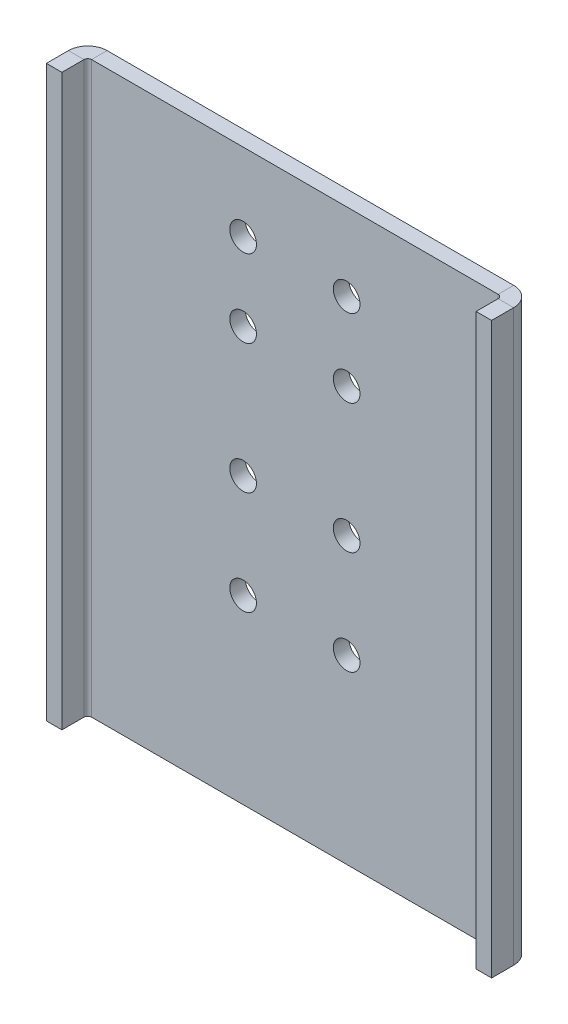
ISO-10303-21;
HEADER;
FILE_DESCRIPTION(('STEP AP214'),'2;1');
FILE_NAME('part.step','',(''),(''),'','','');
FILE_SCHEMA(('AUTOMOTIVE_DESIGN { 1 0 10303 214 1 1 1 1 }'));
ENDSEC;
DATA;
#1=APPLICATION_CONTEXT('core data for automotive mechanical design processes');
#2=APPLICATION_PROTOCOL_DEFINITION('international standard','automotive_design',2000,#1);
#3=PRODUCT_CONTEXT('',#1,'mechanical');
#4=PRODUCT('Part','Part','',(#3));
#5=PRODUCT_RELATED_PRODUCT_CATEGORY('part','',(#4));
#6=PRODUCT_DEFINITION_FORMATION('','',#4);
#7=PRODUCT_DEFINITION_CONTEXT('part definition',#1,'design');
#8=PRODUCT_DEFINITION('design','',#6,#7);
#9=PRODUCT_DEFINITION_SHAPE('','',#8);
#10=(LENGTH_UNIT() NAMED_UNIT(*) SI_UNIT(.MILLI.,.METRE.));
#11=(NAMED_UNIT(*) PLANE_ANGLE_UNIT() SI_UNIT($,.RADIAN.));
#12=(NAMED_UNIT(*) SI_UNIT($,.STERADIAN.) SOLID_ANGLE_UNIT());
#13=UNCERTAINTY_MEASURE_WITH_UNIT(LENGTH_MEASURE(1.E-05),#10,'distance_accuracy_value','');
#14=(GEOMETRIC_REPRESENTATION_CONTEXT(3) GLOBAL_UNCERTAINTY_ASSIGNED_CONTEXT((#13)) GLOBAL_UNIT_ASSIGNED_CONTEXT((#10,
#11,#12)) REPRESENTATION_CONTEXT('',''));
#15=CARTESIAN_POINT('',(0.,0.,0.));
#16=DIRECTION('',(0.,0.,1.));
#17=DIRECTION('',(1.,0.,0.));
#18=AXIS2_PLACEMENT_3D('',#15,#16,#17);
#19=CARTESIAN_POINT('',(0.,0.,-3.));
#20=DIRECTION('',(0.,0.,1.));
#21=DIRECTION('',(1.,0.,0.));
#22=AXIS2_PLACEMENT_3D('',#19,#20,#21);
#23=PLANE('',#22);
#24=CARTESIAN_POINT('',(10.,0.,-3.));
#25=DIRECTION('',(0.,0.,1.));
#26=DIRECTION('',(1.,0.,0.));
#27=AXIS2_PLACEMENT_3D('',#24,#25,#26);
#28=CIRCLE('',#27,2.58);
#29=CARTESIAN_POINT('',(12.58,0.,-3.));
#30=VERTEX_POINT('',#29);
#31=EDGE_CURVE('E310',#30,#30,#28,.T.);
#32=ORIENTED_EDGE('',*,*,#31,.T.);
#33=EDGE_LOOP('',(#32));
#34=FACE_BOUND('',#33,.T.);
#35=CARTESIAN_POINT('',(10.,25.,-3.));
#36=DIRECTION('',(0.,0.,1.));
#37=DIRECTION('',(1.,0.,0.));
#38=AXIS2_PLACEMENT_3D('',#35,#36,#37);
#39=CIRCLE('',#38,2.58);
#40=CARTESIAN_POINT('',(12.58,25.,-3.));
#41=VERTEX_POINT('',#40);
#42=EDGE_CURVE('E303',#41,#41,#39,.T.);
#43=ORIENTED_EDGE('',*,*,#42,.T.);
#44=EDGE_LOOP('',(#43));
#45=FACE_BOUND('',#44,.T.);
#46=CARTESIAN_POINT('',(-10.,25.,-3.));
#47=DIRECTION('',(0.,0.,1.));
#48=DIRECTION('',(1.,0.,0.));
#49=AXIS2_PLACEMENT_3D('',#46,#47,#48);
#50=CIRCLE('',#49,2.58);
#51=CARTESIAN_POINT('',(-7.42,25.,-3.));
#52=VERTEX_POINT('',#51);
#53=EDGE_CURVE('E322',#52,#52,#50,.T.);
#54=ORIENTED_EDGE('',*,*,#53,.T.);
#55=EDGE_LOOP('',(#54));
#56=FACE_BOUND('',#55,.T.);
#57=CARTESIAN_POINT('',(10.,40.,-3.));
#58=DIRECTION('',(0.,0.,1.));
#59=DIRECTION('',(1.,0.,0.));
#60=AXIS2_PLACEMENT_3D('',#57,#58,#59);
#61=CIRCLE('',#60,2.58);
#62=CARTESIAN_POINT('',(12.58,40.,-3.));
#63=VERTEX_POINT('',#62);
#64=EDGE_CURVE('E315',#63,#63,#61,.T.);
#65=ORIENTED_EDGE('',*,*,#64,.T.);
#66=EDGE_LOOP('',(#65));
#67=FACE_BOUND('',#66,.T.);
#68=CARTESIAN_POINT('',(-10.,0.,-3.));
#69=DIRECTION('',(0.,0.,1.));
#70=DIRECTION('',(1.,0.,0.));
#71=AXIS2_PLACEMENT_3D('',#68,#69,#70);
#72=CIRCLE('',#71,2.58);
#73=CARTESIAN_POINT('',(-7.42,0.,-3.));
#74=VERTEX_POINT('',#73);
#75=EDGE_CURVE('E285',#74,#74,#72,.T.);
#76=ORIENTED_EDGE('',*,*,#75,.T.);
#77=EDGE_LOOP('',(#76));
#78=FACE_BOUND('',#77,.T.);
#79=CARTESIAN_POINT('',(-10.,-20.,-3.));
#80=DIRECTION('',(0.,0.,1.));
#81=DIRECTION('',(1.,0.,0.));
#82=AXIS2_PLACEMENT_3D('',#79,#80,#81);
#83=CIRCLE('',#82,2.58);
#84=CARTESIAN_POINT('',(-7.42,-20.,-3.));
#85=VERTEX_POINT('',#84);
#86=EDGE_CURVE('E292',#85,#85,#83,.T.);
#87=ORIENTED_EDGE('',*,*,#86,.T.);
#88=EDGE_LOOP('',(#87));
#89=FACE_BOUND('',#88,.T.);
#90=CARTESIAN_POINT('',(10.,-20.,-3.));
#91=DIRECTION('',(0.,0.,1.));
#92=DIRECTION('',(1.,0.,0.));
#93=AXIS2_PLACEMENT_3D('',#90,#91,#92);
#94=CIRCLE('',#93,2.58);
#95=CARTESIAN_POINT('',(12.58,-20.,-3.));
#96=VERTEX_POINT('',#95);
#97=EDGE_CURVE('E298',#96,#96,#94,.T.);
#98=ORIENTED_EDGE('',*,*,#97,.T.);
#99=EDGE_LOOP('',(#98));
#100=FACE_BOUND('',#99,.T.);
#101=CARTESIAN_POINT('',(-10.,40.,-3.));
#102=DIRECTION('',(0.,0.,1.));
#103=DIRECTION('',(1.,0.,0.));
#104=AXIS2_PLACEMENT_3D('',#101,#102,#103);
#105=CIRCLE('',#104,2.58);
#106=CARTESIAN_POINT('',(-7.42,40.,-3.));
#107=VERTEX_POINT('',#106);
#108=EDGE_CURVE('E327',#107,#107,#105,.T.);
#109=ORIENTED_EDGE('',*,*,#108,.T.);
#110=EDGE_LOOP('',(#109));
#111=FACE_BOUND('',#110,.T.);
#112=DIRECTION('',(0.,1.,0.));
#113=VECTOR('',#112,1.);
#114=CARTESIAN_POINT('',(39.2634,55.,-3.));
#115=LINE('',#114,#113);
#116=CARTESIAN_POINT('',(39.2634,55.,-3.));
#117=VERTEX_POINT('',#116);
#118=CARTESIAN_POINT('',(39.2634,-55.,-3.));
#119=VERTEX_POINT('',#118);
#120=EDGE_CURVE('E211',#117,#119,#115,.F.);
#121=ORIENTED_EDGE('',*,*,#120,.T.);
#122=DIRECTION('',(1.,0.,0.));
#123=VECTOR('',#122,1.);
#124=CARTESIAN_POINT('',(-43.,-55.,-3.));
#125=LINE('',#124,#123);
#126=CARTESIAN_POINT('',(-39.2634,-55.,-3.));
#127=VERTEX_POINT('',#126);
#128=EDGE_CURVE('E13',#127,#119,#125,.T.);
#129=ORIENTED_EDGE('',*,*,#128,.F.);
#130=DIRECTION('',(0.,-1.,0.));
#131=VECTOR('',#130,1.);
#132=CARTESIAN_POINT('',(-39.2634,-55.,-3.));
#133=LINE('',#132,#131);
#134=CARTESIAN_POINT('',(-39.2634,55.,-3.));
#135=VERTEX_POINT('',#134);
#136=EDGE_CURVE('E264',#127,#135,#133,.F.);
#137=ORIENTED_EDGE('',*,*,#136,.T.);
#138=DIRECTION('',(-1.,0.,0.));
#139=VECTOR('',#138,1.);
#140=CARTESIAN_POINT('',(-43.,55.,-3.));
#141=LINE('',#140,#139);
#142=EDGE_CURVE('E87',#117,#135,#141,.T.);
#143=ORIENTED_EDGE('',*,*,#142,.F.);
#144=EDGE_LOOP('',(#121,#129,#137,#143));
#145=FACE_BOUND('',#144,.T.);
#146=ADVANCED_FACE('F78',(#34,#45,#56,#67,#78,#89,#100,#111,#145),#23,.F.);
#147=CARTESIAN_POINT('',(0.,0.,0.));
#148=DIRECTION('',(0.,0.,1.));
#149=DIRECTION('',(1.,0.,0.));
#150=AXIS2_PLACEMENT_3D('',#147,#148,#149);
#151=PLANE('',#150);
#152=CARTESIAN_POINT('',(10.,0.,0.));
#153=DIRECTION('',(0.,0.,1.));
#154=DIRECTION('',(1.,0.,0.));
#155=AXIS2_PLACEMENT_3D('',#152,#153,#154);
#156=CIRCLE('',#155,2.58);
#157=CARTESIAN_POINT('',(12.58,0.,0.));
#158=VERTEX_POINT('',#157);
#159=EDGE_CURVE('E288',#158,#158,#156,.T.);
#160=ORIENTED_EDGE('',*,*,#159,.F.);
#161=EDGE_LOOP('',(#160));
#162=FACE_BOUND('',#161,.T.);
#163=CARTESIAN_POINT('',(10.,25.,0.));
#164=DIRECTION('',(0.,0.,1.));
#165=DIRECTION('',(1.,0.,0.));
#166=AXIS2_PLACEMENT_3D('',#163,#164,#165);
#167=CIRCLE('',#166,2.58);
#168=CARTESIAN_POINT('',(12.58,25.,0.));
#169=VERTEX_POINT('',#168);
#170=EDGE_CURVE('E307',#169,#169,#167,.T.);
#171=ORIENTED_EDGE('',*,*,#170,.F.);
#172=EDGE_LOOP('',(#171));
#173=FACE_BOUND('',#172,.T.);
#174=CARTESIAN_POINT('',(-10.,25.,0.));
#175=DIRECTION('',(0.,0.,1.));
#176=DIRECTION('',(1.,0.,0.));
#177=AXIS2_PLACEMENT_3D('',#174,#175,#176);
#178=CIRCLE('',#177,2.58);
#179=CARTESIAN_POINT('',(-7.42,25.,0.));
#180=VERTEX_POINT('',#179);
#181=EDGE_CURVE('E306',#180,#180,#178,.T.);
#182=ORIENTED_EDGE('',*,*,#181,.F.);
#183=EDGE_LOOP('',(#182));
#184=FACE_BOUND('',#183,.T.);
#185=CARTESIAN_POINT('',(10.,40.,0.));
#186=DIRECTION('',(0.,0.,1.));
#187=DIRECTION('',(1.,0.,0.));
#188=AXIS2_PLACEMENT_3D('',#185,#186,#187);
#189=CIRCLE('',#188,2.58);
#190=CARTESIAN_POINT('',(12.58,40.,0.));
#191=VERTEX_POINT('',#190);
#192=EDGE_CURVE('E319',#191,#191,#189,.T.);
#193=ORIENTED_EDGE('',*,*,#192,.F.);
#194=EDGE_LOOP('',(#193));
#195=FACE_BOUND('',#194,.T.);
#196=CARTESIAN_POINT('',(-10.,0.,0.));
#197=DIRECTION('',(0.,0.,1.));
#198=DIRECTION('',(1.,0.,0.));
#199=AXIS2_PLACEMENT_3D('',#196,#197,#198);
#200=CIRCLE('',#199,2.58);
#201=CARTESIAN_POINT('',(-7.42,0.,0.));
#202=VERTEX_POINT('',#201);
#203=EDGE_CURVE('E289',#202,#202,#200,.T.);
#204=ORIENTED_EDGE('',*,*,#203,.F.);
#205=EDGE_LOOP('',(#204));
#206=FACE_BOUND('',#205,.T.);
#207=CARTESIAN_POINT('',(-10.,-20.,0.));
#208=DIRECTION('',(0.,0.,1.));
#209=DIRECTION('',(1.,0.,0.));
#210=AXIS2_PLACEMENT_3D('',#207,#208,#209);
#211=CIRCLE('',#210,2.58);
#212=CARTESIAN_POINT('',(-7.42,-20.,0.));
#213=VERTEX_POINT('',#212);
#214=EDGE_CURVE('E295',#213,#213,#211,.T.);
#215=ORIENTED_EDGE('',*,*,#214,.F.);
#216=EDGE_LOOP('',(#215));
#217=FACE_BOUND('',#216,.T.);
#218=CARTESIAN_POINT('',(10.,-20.,0.));
#219=DIRECTION('',(0.,0.,1.));
#220=DIRECTION('',(1.,0.,0.));
#221=AXIS2_PLACEMENT_3D('',#218,#219,#220);
#222=CIRCLE('',#221,2.58);
#223=CARTESIAN_POINT('',(12.58,-20.,0.));
#224=VERTEX_POINT('',#223);
#225=EDGE_CURVE('E282',#224,#224,#222,.T.);
#226=ORIENTED_EDGE('',*,*,#225,.F.);
#227=EDGE_LOOP('',(#226));
#228=FACE_BOUND('',#227,.T.);
#229=CARTESIAN_POINT('',(-10.,40.,0.));
#230=DIRECTION('',(0.,0.,1.));
#231=DIRECTION('',(1.,0.,0.));
#232=AXIS2_PLACEMENT_3D('',#229,#230,#231);
#233=CIRCLE('',#232,2.58);
#234=CARTESIAN_POINT('',(-7.42,40.,0.));
#235=VERTEX_POINT('',#234);
#236=EDGE_CURVE('E318',#235,#235,#233,.T.);
#237=ORIENTED_EDGE('',*,*,#236,.F.);
#238=EDGE_LOOP('',(#237));
#239=FACE_BOUND('',#238,.T.);
#240=DIRECTION('',(1.,0.,0.));
#241=VECTOR('',#240,1.);
#242=CARTESIAN_POINT('',(-43.,-55.,0.));
#243=LINE('',#242,#241);
#244=CARTESIAN_POINT('',(-39.2634,-55.,0.));
#245=VERTEX_POINT('',#244);
#246=CARTESIAN_POINT('',(39.2634,-55.,0.));
#247=VERTEX_POINT('',#246);
#248=EDGE_CURVE('E82',#245,#247,#243,.T.);
#249=ORIENTED_EDGE('',*,*,#248,.T.);
#250=DIRECTION('',(0.,1.,0.));
#251=VECTOR('',#250,1.);
#252=CARTESIAN_POINT('',(39.2634,55.,0.));
#253=LINE('',#252,#251);
#254=CARTESIAN_POINT('',(39.2634,55.,0.));
#255=VERTEX_POINT('',#254);
#256=EDGE_CURVE('E223',#255,#247,#253,.F.);
#257=ORIENTED_EDGE('',*,*,#256,.F.);
#258=DIRECTION('',(-1.,0.,0.));
#259=VECTOR('',#258,1.);
#260=CARTESIAN_POINT('',(-43.,55.,0.));
#261=LINE('',#260,#259);
#262=CARTESIAN_POINT('',(-39.2634,55.,0.));
#263=VERTEX_POINT('',#262);
#264=EDGE_CURVE('E330',#255,#263,#261,.T.);
#265=ORIENTED_EDGE('',*,*,#264,.T.);
#266=DIRECTION('',(0.,-1.,0.));
#267=VECTOR('',#266,1.);
#268=CARTESIAN_POINT('',(-39.2634,-55.,0.));
#269=LINE('',#268,#267);
#270=EDGE_CURVE('E95',#245,#263,#269,.F.);
#271=ORIENTED_EDGE('',*,*,#270,.F.);
#272=EDGE_LOOP('',(#249,#257,#265,#271));
#273=FACE_BOUND('',#272,.T.);
#274=ADVANCED_FACE('F334',(#162,#173,#184,#195,#206,#217,#228,#239,#273),#151,.T.);
#275=CARTESIAN_POINT('',(-43.,55.,-3.));
#276=DIRECTION('',(0.,1.,0.));
#277=DIRECTION('',(0.,0.,1.));
#278=AXIS2_PLACEMENT_3D('',#275,#276,#277);
#279=PLANE('',#278);
#280=ORIENTED_EDGE('',*,*,#264,.F.);
#281=DIRECTION('',(0.,0.,-1.));
#282=VECTOR('',#281,1.);
#283=CARTESIAN_POINT('',(39.2634,55.,0.));
#284=LINE('',#283,#282);
#285=EDGE_CURVE('E217',#255,#117,#284,.T.);
#286=ORIENTED_EDGE('',*,*,#285,.T.);
#287=ORIENTED_EDGE('',*,*,#142,.T.);
#288=DIRECTION('',(0.,0.,-1.));
#289=VECTOR('',#288,1.);
#290=CARTESIAN_POINT('',(-39.2634,55.,0.));
#291=LINE('',#290,#289);
#292=EDGE_CURVE('E279',#263,#135,#291,.T.);
#293=ORIENTED_EDGE('',*,*,#292,.F.);
#294=EDGE_LOOP('',(#280,#286,#287,#293));
#295=FACE_BOUND('',#294,.T.);
#296=ADVANCED_FACE('F80',(#295),#279,.T.);
#297=CARTESIAN_POINT('',(-43.,-55.,-3.));
#298=DIRECTION('',(0.,-1.,0.));
#299=DIRECTION('',(0.,0.,-1.));
#300=AXIS2_PLACEMENT_3D('',#297,#298,#299);
#301=PLANE('',#300);
#302=DIRECTION('',(0.,0.,-1.));
#303=VECTOR('',#302,1.);
#304=CARTESIAN_POINT('',(39.2634,-55.,0.));
#305=LINE('',#304,#303);
#306=EDGE_CURVE('E229',#247,#119,#305,.T.);
#307=ORIENTED_EDGE('',*,*,#306,.F.);
#308=ORIENTED_EDGE('',*,*,#248,.F.);
#309=DIRECTION('',(0.,0.,-1.));
#310=VECTOR('',#309,1.);
#311=CARTESIAN_POINT('',(-39.2634,-55.,0.));
#312=LINE('',#311,#310);
#313=EDGE_CURVE('E270',#245,#127,#312,.T.);
#314=ORIENTED_EDGE('',*,*,#313,.T.);
#315=ORIENTED_EDGE('',*,*,#128,.T.);
#316=EDGE_LOOP('',(#307,#308,#314,#315));
#317=FACE_BOUND('',#316,.T.);
#318=ADVANCED_FACE('F409',(#317),#301,.T.);
#319=CARTESIAN_POINT('',(-10.,40.,-3.));
#320=DIRECTION('',(0.,0.,1.));
#321=DIRECTION('',(1.,0.,0.));
#322=AXIS2_PLACEMENT_3D('',#319,#320,#321);
#323=CYLINDRICAL_SURFACE('',#322,2.58);
#324=ORIENTED_EDGE('',*,*,#108,.F.);
#325=EDGE_LOOP('',(#324));
#326=FACE_BOUND('',#325,.T.);
#327=ORIENTED_EDGE('',*,*,#236,.T.);
#328=EDGE_LOOP('',(#327));
#329=FACE_BOUND('',#328,.T.);
#330=ADVANCED_FACE('F407',(#326,#329),#323,.F.);
#331=CARTESIAN_POINT('',(10.,-20.,-3.));
#332=DIRECTION('',(0.,0.,1.));
#333=DIRECTION('',(1.,0.,0.));
#334=AXIS2_PLACEMENT_3D('',#331,#332,#333);
#335=CYLINDRICAL_SURFACE('',#334,2.58);
#336=ORIENTED_EDGE('',*,*,#97,.F.);
#337=EDGE_LOOP('',(#336));
#338=FACE_BOUND('',#337,.T.);
#339=ORIENTED_EDGE('',*,*,#225,.T.);
#340=EDGE_LOOP('',(#339));
#341=FACE_BOUND('',#340,.T.);
#342=ADVANCED_FACE('F415',(#338,#341),#335,.F.);
#343=CARTESIAN_POINT('',(-10.,-20.,-3.));
#344=DIRECTION('',(0.,0.,1.));
#345=DIRECTION('',(1.,0.,0.));
#346=AXIS2_PLACEMENT_3D('',#343,#344,#345);
#347=CYLINDRICAL_SURFACE('',#346,2.58);
#348=ORIENTED_EDGE('',*,*,#86,.F.);
#349=EDGE_LOOP('',(#348));
#350=FACE_BOUND('',#349,.T.);
#351=ORIENTED_EDGE('',*,*,#214,.T.);
#352=EDGE_LOOP('',(#351));
#353=FACE_BOUND('',#352,.T.);
#354=ADVANCED_FACE('F437',(#350,#353),#347,.F.);
#355=CARTESIAN_POINT('',(-10.,0.,-3.));
#356=DIRECTION('',(0.,0.,1.));
#357=DIRECTION('',(1.,0.,0.));
#358=AXIS2_PLACEMENT_3D('',#355,#356,#357);
#359=CYLINDRICAL_SURFACE('',#358,2.58);
#360=ORIENTED_EDGE('',*,*,#75,.F.);
#361=EDGE_LOOP('',(#360));
#362=FACE_BOUND('',#361,.T.);
#363=ORIENTED_EDGE('',*,*,#203,.T.);
#364=EDGE_LOOP('',(#363));
#365=FACE_BOUND('',#364,.T.);
#366=ADVANCED_FACE('F433',(#362,#365),#359,.F.);
#367=CARTESIAN_POINT('',(10.,40.,-3.));
#368=DIRECTION('',(0.,0.,1.));
#369=DIRECTION('',(1.,0.,0.));
#370=AXIS2_PLACEMENT_3D('',#367,#368,#369);
#371=CYLINDRICAL_SURFACE('',#370,2.58);
#372=ORIENTED_EDGE('',*,*,#64,.F.);
#373=EDGE_LOOP('',(#372));
#374=FACE_BOUND('',#373,.T.);
#375=ORIENTED_EDGE('',*,*,#192,.T.);
#376=EDGE_LOOP('',(#375));
#377=FACE_BOUND('',#376,.T.);
#378=ADVANCED_FACE('F436',(#374,#377),#371,.F.);
#379=CARTESIAN_POINT('',(-10.,25.,-3.));
#380=DIRECTION('',(0.,0.,1.));
#381=DIRECTION('',(1.,0.,0.));
#382=AXIS2_PLACEMENT_3D('',#379,#380,#381);
#383=CYLINDRICAL_SURFACE('',#382,2.58);
#384=ORIENTED_EDGE('',*,*,#53,.F.);
#385=EDGE_LOOP('',(#384));
#386=FACE_BOUND('',#385,.T.);
#387=ORIENTED_EDGE('',*,*,#181,.T.);
#388=EDGE_LOOP('',(#387));
#389=FACE_BOUND('',#388,.T.);
#390=ADVANCED_FACE('F448',(#386,#389),#383,.F.);
#391=CARTESIAN_POINT('',(10.,25.,-3.));
#392=DIRECTION('',(0.,0.,1.));
#393=DIRECTION('',(1.,0.,0.));
#394=AXIS2_PLACEMENT_3D('',#391,#392,#393);
#395=CYLINDRICAL_SURFACE('',#394,2.58);
#396=ORIENTED_EDGE('',*,*,#42,.F.);
#397=EDGE_LOOP('',(#396));
#398=FACE_BOUND('',#397,.T.);
#399=ORIENTED_EDGE('',*,*,#170,.T.);
#400=EDGE_LOOP('',(#399));
#401=FACE_BOUND('',#400,.T.);
#402=ADVANCED_FACE('F445',(#398,#401),#395,.F.);
#403=CARTESIAN_POINT('',(10.,0.,-3.));
#404=DIRECTION('',(0.,0.,1.));
#405=DIRECTION('',(1.,0.,0.));
#406=AXIS2_PLACEMENT_3D('',#403,#404,#405);
#407=CYLINDRICAL_SURFACE('',#406,2.58);
#408=ORIENTED_EDGE('',*,*,#31,.F.);
#409=EDGE_LOOP('',(#408));
#410=FACE_BOUND('',#409,.T.);
#411=ORIENTED_EDGE('',*,*,#159,.T.);
#412=EDGE_LOOP('',(#411));
#413=FACE_BOUND('',#412,.T.);
#414=ADVANCED_FACE('F431',(#410,#413),#407,.F.);
#415=CARTESIAN_POINT('',(-39.2634,55.,0.736599999999999));
#416=DIRECTION('',(0.,1.,0.));
#417=DIRECTION('',(0.,0.,1.));
#418=AXIS2_PLACEMENT_3D('',#415,#416,#417);
#419=PLANE('',#418);
#420=DIRECTION('',(1.,0.,0.));
#421=VECTOR('',#420,1.);
#422=CARTESIAN_POINT('',(-43.,55.,0.736599999999984));
#423=LINE('',#422,#421);
#424=CARTESIAN_POINT('',(-40.,55.,0.736599999999996));
#425=VERTEX_POINT('',#424);
#426=CARTESIAN_POINT('',(-43.,54.9999999999999,0.736599999999984));
#427=VERTEX_POINT('',#426);
#428=EDGE_CURVE('E232',#425,#427,#423,.F.);
#429=ORIENTED_EDGE('',*,*,#428,.F.);
#430=CARTESIAN_POINT('',(-39.2634,55.,0.736599999999999));
#431=DIRECTION('',(0.,-1.,0.));
#432=DIRECTION('',(0.,0.,-1.));
#433=AXIS2_PLACEMENT_3D('',#430,#431,#432);
#434=CIRCLE('',#433,0.736600000000004);
#435=EDGE_CURVE('E273',#263,#425,#434,.F.);
#436=ORIENTED_EDGE('',*,*,#435,.F.);
#437=ORIENTED_EDGE('',*,*,#292,.T.);
#438=CARTESIAN_POINT('',(-39.2634,54.9999999999999,0.736599999999999));
#439=DIRECTION('',(0.,-1.,0.));
#440=DIRECTION('',(0.,0.,-1.));
#441=AXIS2_PLACEMENT_3D('',#438,#439,#440);
#442=CIRCLE('',#441,3.7366);
#443=EDGE_CURVE('E266',#135,#427,#442,.F.);
#444=ORIENTED_EDGE('',*,*,#443,.T.);
#445=EDGE_LOOP('',(#429,#436,#437,#444));
#446=FACE_BOUND('',#445,.T.);
#447=ADVANCED_FACE('F365',(#446),#419,.T.);
#448=CARTESIAN_POINT('',(-39.2634,-55.,0.736600000000008));
#449=DIRECTION('',(0.,1.,0.));
#450=DIRECTION('',(0.,0.,1.));
#451=AXIS2_PLACEMENT_3D('',#448,#449,#450);
#452=PLANE('',#451);
#453=CARTESIAN_POINT('',(-39.2634,-55.,0.736600000000008));
#454=DIRECTION('',(0.,-1.,0.));
#455=DIRECTION('',(0.,0.,-1.));
#456=AXIS2_PLACEMENT_3D('',#453,#454,#455);
#457=CIRCLE('',#456,0.736600000000004);
#458=CARTESIAN_POINT('',(-40.,-55.,0.736600000000005));
#459=VERTEX_POINT('',#458);
#460=EDGE_CURVE('E237',#459,#245,#457,.T.);
#461=ORIENTED_EDGE('',*,*,#460,.F.);
#462=DIRECTION('',(1.,0.,0.));
#463=VECTOR('',#462,1.);
#464=CARTESIAN_POINT('',(-40.,-55.,0.736600000000004));
#465=LINE('',#464,#463);
#466=CARTESIAN_POINT('',(-43.,-55.,0.736599999999991));
#467=VERTEX_POINT('',#466);
#468=EDGE_CURVE('E257',#459,#467,#465,.F.);
#469=ORIENTED_EDGE('',*,*,#468,.T.);
#470=CARTESIAN_POINT('',(-39.2634,-55.,0.736600000000008));
#471=DIRECTION('',(0.,-1.,0.));
#472=DIRECTION('',(0.,0.,-1.));
#473=AXIS2_PLACEMENT_3D('',#470,#471,#472);
#474=CIRCLE('',#473,3.7366);
#475=EDGE_CURVE('E267',#467,#127,#474,.T.);
#476=ORIENTED_EDGE('',*,*,#475,.T.);
#477=ORIENTED_EDGE('',*,*,#313,.F.);
#478=EDGE_LOOP('',(#461,#469,#476,#477));
#479=FACE_BOUND('',#478,.T.);
#480=ADVANCED_FACE('F385',(#479),#452,.F.);
#481=CARTESIAN_POINT('',(-39.2634,-55.,0.736600000000008));
#482=DIRECTION('',(0.,-1.,0.));
#483=DIRECTION('',(-1.,0.,0.));
#484=AXIS2_PLACEMENT_3D('',#481,#482,#483);
#485=CYLINDRICAL_SURFACE('',#484,3.7366);
#486=ORIENTED_EDGE('',*,*,#136,.F.);
#487=ORIENTED_EDGE('',*,*,#475,.F.);
#488=DIRECTION('',(0.,-1.,0.));
#489=VECTOR('',#488,1.);
#490=CARTESIAN_POINT('',(-43.,55.,0.736599999999984));
#491=LINE('',#490,#489);
#492=EDGE_CURVE('E255',#467,#427,#491,.F.);
#493=ORIENTED_EDGE('',*,*,#492,.T.);
#494=ORIENTED_EDGE('',*,*,#443,.F.);
#495=EDGE_LOOP('',(#486,#487,#493,#494));
#496=FACE_BOUND('',#495,.T.);
#497=ADVANCED_FACE('F420',(#496),#485,.T.);
#498=CARTESIAN_POINT('',(-39.2634,-55.,0.736600000000008));
#499=DIRECTION('',(0.,-1.,0.));
#500=DIRECTION('',(-1.,0.,0.));
#501=AXIS2_PLACEMENT_3D('',#498,#499,#500);
#502=CYLINDRICAL_SURFACE('',#501,0.736600000000004);
#503=ORIENTED_EDGE('',*,*,#270,.T.);
#504=ORIENTED_EDGE('',*,*,#435,.T.);
#505=DIRECTION('',(0.,-1.,0.));
#506=VECTOR('',#505,1.);
#507=CARTESIAN_POINT('',(-40.,55.,0.736599999999997));
#508=LINE('',#507,#506);
#509=EDGE_CURVE('E260',#425,#459,#508,.T.);
#510=ORIENTED_EDGE('',*,*,#509,.T.);
#511=ORIENTED_EDGE('',*,*,#460,.T.);
#512=EDGE_LOOP('',(#503,#504,#510,#511));
#513=FACE_BOUND('',#512,.T.);
#514=ADVANCED_FACE('F362',(#513),#502,.F.);
#515=CARTESIAN_POINT('',(-43.,55.,0.));
#516=DIRECTION('',(0.,-1.,0.));
#517=DIRECTION('',(0.,0.,-1.));
#518=AXIS2_PLACEMENT_3D('',#515,#516,#517);
#519=PLANE('',#518);
#520=ORIENTED_EDGE('',*,*,#428,.T.);
#521=DIRECTION('',(0.,0.,-1.));
#522=VECTOR('',#521,1.);
#523=CARTESIAN_POINT('',(-43.,55.,-3.42153572623294E-13));
#524=LINE('',#523,#522);
#525=CARTESIAN_POINT('',(-43.,55.,5.));
#526=VERTEX_POINT('',#525);
#527=EDGE_CURVE('E245',#526,#427,#524,.T.);
#528=ORIENTED_EDGE('',*,*,#527,.F.);
#529=DIRECTION('',(1.,0.,0.));
#530=VECTOR('',#529,1.);
#531=CARTESIAN_POINT('',(-43.,55.,5.));
#532=LINE('',#531,#530);
#533=CARTESIAN_POINT('',(-40.,55.,5.00000000000001));
#534=VERTEX_POINT('',#533);
#535=EDGE_CURVE('E238',#526,#534,#532,.T.);
#536=ORIENTED_EDGE('',*,*,#535,.T.);
#537=DIRECTION('',(0.,0.,1.));
#538=VECTOR('',#537,1.);
#539=CARTESIAN_POINT('',(-40.,55.,0.));
#540=LINE('',#539,#538);
#541=EDGE_CURVE('E252',#534,#425,#540,.F.);
#542=ORIENTED_EDGE('',*,*,#541,.T.);
#543=EDGE_LOOP('',(#520,#528,#536,#542));
#544=FACE_BOUND('',#543,.T.);
#545=ADVANCED_FACE('F368',(#544),#519,.F.);
#546=CARTESIAN_POINT('',(-43.,-55.,5.));
#547=DIRECTION('',(0.,1.,0.));
#548=DIRECTION('',(0.,0.,1.));
#549=AXIS2_PLACEMENT_3D('',#546,#547,#548);
#550=PLANE('',#549);
#551=ORIENTED_EDGE('',*,*,#468,.F.);
#552=DIRECTION('',(0.,0.,-1.));
#553=VECTOR('',#552,1.);
#554=CARTESIAN_POINT('',(-40.,-55.,5.00000000000001));
#555=LINE('',#554,#553);
#556=CARTESIAN_POINT('',(-40.,-55.,5.00000000000001));
#557=VERTEX_POINT('',#556);
#558=EDGE_CURVE('E250',#459,#557,#555,.F.);
#559=ORIENTED_EDGE('',*,*,#558,.T.);
#560=DIRECTION('',(1.,0.,0.));
#561=VECTOR('',#560,1.);
#562=CARTESIAN_POINT('',(-43.,-55.,5.));
#563=LINE('',#562,#561);
#564=CARTESIAN_POINT('',(-43.,-55.,5.));
#565=VERTEX_POINT('',#564);
#566=EDGE_CURVE('E234',#565,#557,#563,.T.);
#567=ORIENTED_EDGE('',*,*,#566,.F.);
#568=DIRECTION('',(0.,0.,1.));
#569=VECTOR('',#568,1.);
#570=CARTESIAN_POINT('',(-43.,-55.,0.));
#571=LINE('',#570,#569);
#572=EDGE_CURVE('E243',#467,#565,#571,.T.);
#573=ORIENTED_EDGE('',*,*,#572,.F.);
#574=EDGE_LOOP('',(#551,#559,#567,#573));
#575=FACE_BOUND('',#574,.T.);
#576=ADVANCED_FACE('F387',(#575),#550,.F.);
#577=CARTESIAN_POINT('',(-43.,0.,-1.89497906737335E-13));
#578=DIRECTION('',(1.,0.,0.));
#579=DIRECTION('',(0.,0.,-1.));
#580=AXIS2_PLACEMENT_3D('',#577,#578,#579);
#581=PLANE('',#580);
#582=ORIENTED_EDGE('',*,*,#492,.F.);
#583=ORIENTED_EDGE('',*,*,#572,.T.);
#584=DIRECTION('',(0.,1.,0.));
#585=VECTOR('',#584,1.);
#586=CARTESIAN_POINT('',(-43.,0.,5.));
#587=LINE('',#586,#585);
#588=EDGE_CURVE('E241',#565,#526,#587,.T.);
#589=ORIENTED_EDGE('',*,*,#588,.T.);
#590=ORIENTED_EDGE('',*,*,#527,.T.);
#591=EDGE_LOOP('',(#582,#583,#589,#590));
#592=FACE_BOUND('',#591,.T.);
#593=ADVANCED_FACE('F372',(#592),#581,.F.);
#594=CARTESIAN_POINT('',(-40.,0.,-1.79023462720806E-13));
#595=DIRECTION('',(1.,0.,0.));
#596=DIRECTION('',(0.,0.,-1.));
#597=AXIS2_PLACEMENT_3D('',#594,#595,#596);
#598=PLANE('',#597);
#599=ORIENTED_EDGE('',*,*,#558,.F.);
#600=ORIENTED_EDGE('',*,*,#509,.F.);
#601=ORIENTED_EDGE('',*,*,#541,.F.);
#602=DIRECTION('',(0.,-1.,0.));
#603=VECTOR('',#602,1.);
#604=CARTESIAN_POINT('',(-40.,55.,5.00000000000001));
#605=LINE('',#604,#603);
#606=EDGE_CURVE('E248',#557,#534,#605,.F.);
#607=ORIENTED_EDGE('',*,*,#606,.F.);
#608=EDGE_LOOP('',(#599,#600,#601,#607));
#609=FACE_BOUND('',#608,.T.);
#610=ADVANCED_FACE('F382',(#609),#598,.T.);
#611=CARTESIAN_POINT('',(-43.,55.,5.));
#612=DIRECTION('',(0.,0.,-1.));
#613=DIRECTION('',(-1.,0.,0.));
#614=AXIS2_PLACEMENT_3D('',#611,#612,#613);
#615=PLANE('',#614);
#616=ORIENTED_EDGE('',*,*,#606,.T.);
#617=ORIENTED_EDGE('',*,*,#535,.F.);
#618=ORIENTED_EDGE('',*,*,#588,.F.);
#619=ORIENTED_EDGE('',*,*,#566,.T.);
#620=EDGE_LOOP('',(#616,#617,#618,#619));
#621=FACE_BOUND('',#620,.T.);
#622=ADVANCED_FACE('F378',(#621),#615,.F.);
#623=CARTESIAN_POINT('',(39.2634,-55.,0.7366));
#624=DIRECTION('',(0.,-1.,0.));
#625=DIRECTION('',(0.,0.,-1.));
#626=AXIS2_PLACEMENT_3D('',#623,#624,#625);
#627=PLANE('',#626);
#628=DIRECTION('',(-1.,0.,0.));
#629=VECTOR('',#628,1.);
#630=CARTESIAN_POINT('',(43.,-55.,0.736599999999984));
#631=LINE('',#630,#629);
#632=CARTESIAN_POINT('',(40.,-55.,0.736599999999997));
#633=VERTEX_POINT('',#632);
#634=CARTESIAN_POINT('',(43.,-55.,0.736599999999984));
#635=VERTEX_POINT('',#634);
#636=EDGE_CURVE('E194',#633,#635,#631,.F.);
#637=ORIENTED_EDGE('',*,*,#636,.F.);
#638=CARTESIAN_POINT('',(39.2634,-55.,0.7366));
#639=DIRECTION('',(0.,1.,0.));
#640=DIRECTION('',(0.,0.,1.));
#641=AXIS2_PLACEMENT_3D('',#638,#639,#640);
#642=CIRCLE('',#641,0.736600000000004);
#643=EDGE_CURVE('E220',#247,#633,#642,.F.);
#644=ORIENTED_EDGE('',*,*,#643,.F.);
#645=ORIENTED_EDGE('',*,*,#306,.T.);
#646=CARTESIAN_POINT('',(39.2634,-55.,0.7366));
#647=DIRECTION('',(0.,1.,0.));
#648=DIRECTION('',(0.,0.,1.));
#649=AXIS2_PLACEMENT_3D('',#646,#647,#648);
#650=CIRCLE('',#649,3.7366);
#651=EDGE_CURVE('E213',#119,#635,#650,.F.);
#652=ORIENTED_EDGE('',*,*,#651,.T.);
#653=EDGE_LOOP('',(#637,#644,#645,#652));
#654=FACE_BOUND('',#653,.T.);
#655=ADVANCED_FACE('F343',(#654),#627,.T.);
#656=CARTESIAN_POINT('',(39.2634,55.,0.7366));
#657=DIRECTION('',(0.,-1.,0.));
#658=DIRECTION('',(0.,0.,-1.));
#659=AXIS2_PLACEMENT_3D('',#656,#657,#658);
#660=PLANE('',#659);
#661=CARTESIAN_POINT('',(39.2634,55.,0.7366));
#662=DIRECTION('',(0.,1.,0.));
#663=DIRECTION('',(0.,0.,1.));
#664=AXIS2_PLACEMENT_3D('',#661,#662,#663);
#665=CIRCLE('',#664,0.736600000000004);
#666=CARTESIAN_POINT('',(40.,55.,0.736599999999997));
#667=VERTEX_POINT('',#666);
#668=EDGE_CURVE('E226',#667,#255,#665,.T.);
#669=ORIENTED_EDGE('',*,*,#668,.F.);
#670=DIRECTION('',(-1.,0.,0.));
#671=VECTOR('',#670,1.);
#672=CARTESIAN_POINT('',(40.,55.,0.736599999999997));
#673=LINE('',#672,#671);
#674=CARTESIAN_POINT('',(43.,55.,0.736599999999984));
#675=VERTEX_POINT('',#674);
#676=EDGE_CURVE('E205',#667,#675,#673,.F.);
#677=ORIENTED_EDGE('',*,*,#676,.T.);
#678=CARTESIAN_POINT('',(39.2634,55.,0.7366));
#679=DIRECTION('',(0.,1.,0.));
#680=DIRECTION('',(0.,0.,1.));
#681=AXIS2_PLACEMENT_3D('',#678,#679,#680);
#682=CIRCLE('',#681,3.7366);
#683=EDGE_CURVE('E214',#675,#117,#682,.T.);
#684=ORIENTED_EDGE('',*,*,#683,.T.);
#685=ORIENTED_EDGE('',*,*,#285,.F.);
#686=EDGE_LOOP('',(#669,#677,#684,#685));
#687=FACE_BOUND('',#686,.T.);
#688=ADVANCED_FACE('F357',(#687),#660,.F.);
#689=CARTESIAN_POINT('',(39.2634,55.,0.7366));
#690=DIRECTION('',(0.,1.,0.));
#691=DIRECTION('',(1.,0.,0.));
#692=AXIS2_PLACEMENT_3D('',#689,#690,#691);
#693=CYLINDRICAL_SURFACE('',#692,3.7366);
#694=ORIENTED_EDGE('',*,*,#120,.F.);
#695=ORIENTED_EDGE('',*,*,#683,.F.);
#696=DIRECTION('',(0.,1.,0.));
#697=VECTOR('',#696,1.);
#698=CARTESIAN_POINT('',(43.,-55.,0.736599999999984));
#699=LINE('',#698,#697);
#700=EDGE_CURVE('E203',#675,#635,#699,.F.);
#701=ORIENTED_EDGE('',*,*,#700,.T.);
#702=ORIENTED_EDGE('',*,*,#651,.F.);
#703=EDGE_LOOP('',(#694,#695,#701,#702));
#704=FACE_BOUND('',#703,.T.);
#705=ADVANCED_FACE('F347',(#704),#693,.T.);
#706=CARTESIAN_POINT('',(39.2634,55.,0.7366));
#707=DIRECTION('',(0.,1.,0.));
#708=DIRECTION('',(1.,0.,0.));
#709=AXIS2_PLACEMENT_3D('',#706,#707,#708);
#710=CYLINDRICAL_SURFACE('',#709,0.736600000000004);
#711=ORIENTED_EDGE('',*,*,#256,.T.);
#712=ORIENTED_EDGE('',*,*,#643,.T.);
#713=DIRECTION('',(0.,1.,0.));
#714=VECTOR('',#713,1.);
#715=CARTESIAN_POINT('',(40.,-55.,0.736599999999997));
#716=LINE('',#715,#714);
#717=EDGE_CURVE('E208',#633,#667,#716,.T.);
#718=ORIENTED_EDGE('',*,*,#717,.T.);
#719=ORIENTED_EDGE('',*,*,#668,.T.);
#720=EDGE_LOOP('',(#711,#712,#718,#719));
#721=FACE_BOUND('',#720,.T.);
#722=ADVANCED_FACE('F339',(#721),#710,.F.);
#723=CARTESIAN_POINT('',(43.,-55.,0.));
#724=DIRECTION('',(0.,1.,0.));
#725=DIRECTION('',(0.,0.,1.));
#726=AXIS2_PLACEMENT_3D('',#723,#724,#725);
#727=PLANE('',#726);
#728=ORIENTED_EDGE('',*,*,#636,.T.);
#729=DIRECTION('',(0.,0.,-1.));
#730=VECTOR('',#729,1.);
#731=CARTESIAN_POINT('',(43.,-55.,0.));
#732=LINE('',#731,#730);
#733=CARTESIAN_POINT('',(43.,-55.,5.));
#734=VERTEX_POINT('',#733);
#735=EDGE_CURVE('E175',#734,#635,#732,.T.);
#736=ORIENTED_EDGE('',*,*,#735,.F.);
#737=DIRECTION('',(-1.,0.,0.));
#738=VECTOR('',#737,1.);
#739=CARTESIAN_POINT('',(43.,-55.,5.));
#740=LINE('',#739,#738);
#741=CARTESIAN_POINT('',(40.,-55.,5.00000000000001));
#742=VERTEX_POINT('',#741);
#743=EDGE_CURVE('E181',#734,#742,#740,.T.);
#744=ORIENTED_EDGE('',*,*,#743,.T.);
#745=DIRECTION('',(0.,0.,1.));
#746=VECTOR('',#745,1.);
#747=CARTESIAN_POINT('',(40.,-55.,0.));
#748=LINE('',#747,#746);
#749=EDGE_CURVE('E201',#742,#633,#748,.F.);
#750=ORIENTED_EDGE('',*,*,#749,.T.);
#751=EDGE_LOOP('',(#728,#736,#744,#750));
#752=FACE_BOUND('',#751,.T.);
#753=ADVANCED_FACE('F193',(#752),#727,.F.);
#754=CARTESIAN_POINT('',(43.,55.,5.));
#755=DIRECTION('',(0.,-1.,0.));
#756=DIRECTION('',(0.,0.,-1.));
#757=AXIS2_PLACEMENT_3D('',#754,#755,#756);
#758=PLANE('',#757);
#759=ORIENTED_EDGE('',*,*,#676,.F.);
#760=DIRECTION('',(0.,0.,-1.));
#761=VECTOR('',#760,1.);
#762=CARTESIAN_POINT('',(40.,55.,5.00000000000001));
#763=LINE('',#762,#761);
#764=CARTESIAN_POINT('',(40.,55.,5.00000000000001));
#765=VERTEX_POINT('',#764);
#766=EDGE_CURVE('E197',#667,#765,#763,.F.);
#767=ORIENTED_EDGE('',*,*,#766,.T.);
#768=DIRECTION('',(-1.,0.,0.));
#769=VECTOR('',#768,1.);
#770=CARTESIAN_POINT('',(43.,55.,5.));
#771=LINE('',#770,#769);
#772=CARTESIAN_POINT('',(43.,55.,5.));
#773=VERTEX_POINT('',#772);
#774=EDGE_CURVE('E190',#773,#765,#771,.T.);
#775=ORIENTED_EDGE('',*,*,#774,.F.);
#776=DIRECTION('',(0.,0.,1.));
#777=VECTOR('',#776,1.);
#778=CARTESIAN_POINT('',(43.,55.,-3.42153572623294E-13));
#779=LINE('',#778,#777);
#780=EDGE_CURVE('E177',#675,#773,#779,.T.);
#781=ORIENTED_EDGE('',*,*,#780,.F.);
#782=EDGE_LOOP('',(#759,#767,#775,#781));
#783=FACE_BOUND('',#782,.T.);
#784=ADVANCED_FACE('F350',(#783),#758,.F.);
#785=CARTESIAN_POINT('',(43.,0.,-1.89497906737335E-13));
#786=DIRECTION('',(-1.,0.,0.));
#787=DIRECTION('',(0.,0.,1.));
#788=AXIS2_PLACEMENT_3D('',#785,#786,#787);
#789=PLANE('',#788);
#790=ORIENTED_EDGE('',*,*,#700,.F.);
#791=ORIENTED_EDGE('',*,*,#780,.T.);
#792=DIRECTION('',(0.,-1.,0.));
#793=VECTOR('',#792,1.);
#794=CARTESIAN_POINT('',(43.,0.,5.));
#795=LINE('',#794,#793);
#796=EDGE_CURVE('E170',#773,#734,#795,.T.);
#797=ORIENTED_EDGE('',*,*,#796,.T.);
#798=ORIENTED_EDGE('',*,*,#735,.T.);
#799=EDGE_LOOP('',(#790,#791,#797,#798));
#800=FACE_BOUND('',#799,.T.);
#801=ADVANCED_FACE('F173',(#800),#789,.F.);
#802=CARTESIAN_POINT('',(40.,0.,-1.79023462720806E-13));
#803=DIRECTION('',(-1.,0.,0.));
#804=DIRECTION('',(0.,0.,1.));
#805=AXIS2_PLACEMENT_3D('',#802,#803,#804);
#806=PLANE('',#805);
#807=ORIENTED_EDGE('',*,*,#766,.F.);
#808=ORIENTED_EDGE('',*,*,#717,.F.);
#809=ORIENTED_EDGE('',*,*,#749,.F.);
#810=DIRECTION('',(0.,1.,0.));
#811=VECTOR('',#810,1.);
#812=CARTESIAN_POINT('',(40.,-55.,5.00000000000001));
#813=LINE('',#812,#811);
#814=EDGE_CURVE('E186',#765,#742,#813,.F.);
#815=ORIENTED_EDGE('',*,*,#814,.F.);
#816=EDGE_LOOP('',(#807,#808,#809,#815));
#817=FACE_BOUND('',#816,.T.);
#818=ADVANCED_FACE('F354',(#817),#806,.T.);
#819=CARTESIAN_POINT('',(43.,-55.,5.));
#820=DIRECTION('',(0.,0.,-1.));
#821=DIRECTION('',(-1.,0.,0.));
#822=AXIS2_PLACEMENT_3D('',#819,#820,#821);
#823=PLANE('',#822);
#824=ORIENTED_EDGE('',*,*,#814,.T.);
#825=ORIENTED_EDGE('',*,*,#743,.F.);
#826=ORIENTED_EDGE('',*,*,#796,.F.);
#827=ORIENTED_EDGE('',*,*,#774,.T.);
#828=EDGE_LOOP('',(#824,#825,#826,#827));
#829=FACE_BOUND('',#828,.T.);
#830=ADVANCED_FACE('F184',(#829),#823,.F.);
#831=CLOSED_SHELL('',(#146,#274,#296,#318,#330,#342,#354,#366,#378,#390,#402,#414,#447,#480,
#497,#514,#545,#576,#593,#610,#622,#655,#688,#705,#722,#753,#784,#801,#818,#830));
#832=MANIFOLD_SOLID_BREP('B2',#831);
#833=ADVANCED_BREP_SHAPE_REPRESENTATION('',(#18,#832),#14);
#834=SHAPE_DEFINITION_REPRESENTATION(#9,#833);
ENDSEC;
END-ISO-10303-21;
